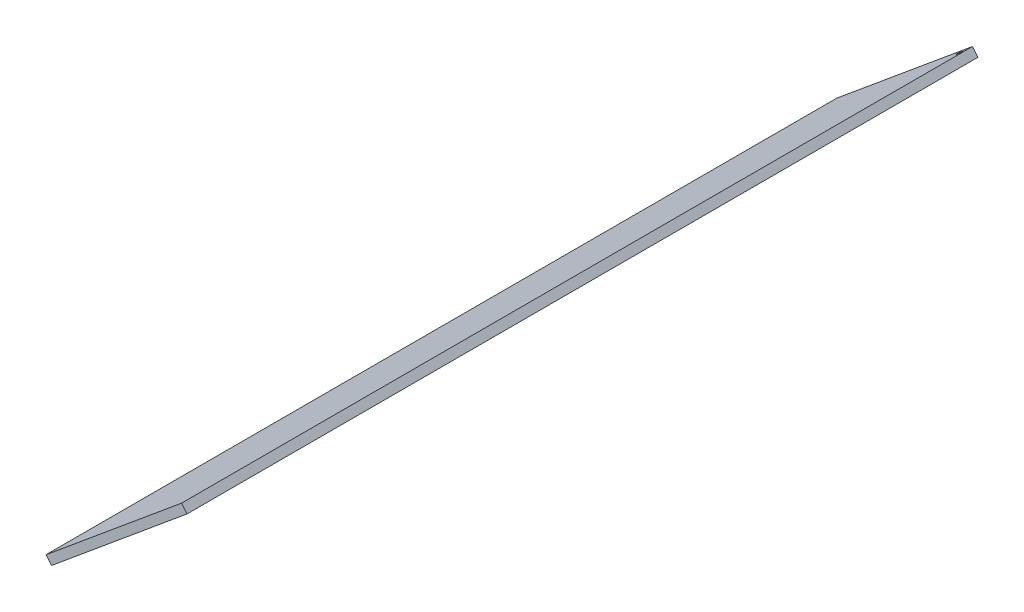
ISO-10303-21;
HEADER;
FILE_DESCRIPTION(('STEP AP214'),'2;1');
FILE_NAME('part.step','',(''),(''),'','','');
FILE_SCHEMA(('AUTOMOTIVE_DESIGN { 1 0 10303 214 1 1 1 1 }'));
ENDSEC;
DATA;
#1=APPLICATION_CONTEXT('core data for automotive mechanical design processes');
#2=APPLICATION_PROTOCOL_DEFINITION('international standard','automotive_design',2000,#1);
#3=PRODUCT_CONTEXT('',#1,'mechanical');
#4=PRODUCT('Part','Part','',(#3));
#5=PRODUCT_RELATED_PRODUCT_CATEGORY('part','',(#4));
#6=PRODUCT_DEFINITION_FORMATION('','',#4);
#7=PRODUCT_DEFINITION_CONTEXT('part definition',#1,'design');
#8=PRODUCT_DEFINITION('design','',#6,#7);
#9=PRODUCT_DEFINITION_SHAPE('','',#8);
#10=(LENGTH_UNIT() NAMED_UNIT(*) SI_UNIT(.MILLI.,.METRE.));
#11=(NAMED_UNIT(*) PLANE_ANGLE_UNIT() SI_UNIT($,.RADIAN.));
#12=(NAMED_UNIT(*) SI_UNIT($,.STERADIAN.) SOLID_ANGLE_UNIT());
#13=UNCERTAINTY_MEASURE_WITH_UNIT(LENGTH_MEASURE(1.E-05),#10,'distance_accuracy_value','');
#14=(GEOMETRIC_REPRESENTATION_CONTEXT(3) GLOBAL_UNCERTAINTY_ASSIGNED_CONTEXT((#13)) GLOBAL_UNIT_ASSIGNED_CONTEXT((#10,
#11,#12)) REPRESENTATION_CONTEXT('',''));
#15=CARTESIAN_POINT('',(0.,0.,0.));
#16=DIRECTION('',(0.,0.,1.));
#17=DIRECTION('',(1.,0.,0.));
#18=AXIS2_PLACEMENT_3D('',#15,#16,#17);
#19=CARTESIAN_POINT('',(104.691015863422,240.200949636311,584.2));
#20=DIRECTION('',(0.769693167120018,0.638413994590309,0.));
#21=DIRECTION('',(-0.638413994590309,0.769693167120018,0.));
#22=AXIS2_PLACEMENT_3D('',#19,#20,#21);
#23=PLANE('',#22);
#24=DIRECTION('',(0.638413994590309,-0.769693167120018,0.));
#25=VECTOR('',#24,1.);
#26=CARTESIAN_POINT('',(104.691015863422,240.200949636311,0.));
#27=LINE('',#26,#25);
#28=CARTESIAN_POINT('',(104.691015863422,240.200949636311,0.));
#29=VERTEX_POINT('',#28);
#30=CARTESIAN_POINT('',(108.744944729071,235.313398025099,0.));
#31=VERTEX_POINT('',#30);
#32=EDGE_CURVE('E104',#29,#31,#27,.T.);
#33=ORIENTED_EDGE('',*,*,#32,.T.);
#34=DIRECTION('',(0.,0.,-1.));
#35=VECTOR('',#34,1.);
#36=CARTESIAN_POINT('',(108.744944729071,235.313398025099,584.2));
#37=LINE('',#36,#35);
#38=CARTESIAN_POINT('',(108.744944729071,235.313398025099,584.2));
#39=VERTEX_POINT('',#38);
#40=EDGE_CURVE('E11',#39,#31,#37,.T.);
#41=ORIENTED_EDGE('',*,*,#40,.F.);
#42=DIRECTION('',(0.638413994590309,-0.769693167120018,0.));
#43=VECTOR('',#42,1.);
#44=CARTESIAN_POINT('',(104.691015863422,240.200949636311,584.2));
#45=LINE('',#44,#43);
#46=CARTESIAN_POINT('',(104.691015863422,240.200949636311,584.2));
#47=VERTEX_POINT('',#46);
#48=EDGE_CURVE('E91',#47,#39,#45,.T.);
#49=ORIENTED_EDGE('',*,*,#48,.F.);
#50=DIRECTION('',(0.,0.,-1.));
#51=VECTOR('',#50,1.);
#52=CARTESIAN_POINT('',(104.691015863422,240.200949636311,584.2));
#53=LINE('',#52,#51);
#54=EDGE_CURVE('E100',#47,#29,#53,.T.);
#55=ORIENTED_EDGE('',*,*,#54,.T.);
#56=EDGE_LOOP('',(#33,#41,#49,#55));
#57=FACE_BOUND('',#56,.T.);
#58=ADVANCED_FACE('F39',(#57),#23,.F.);
#59=CARTESIAN_POINT('',(108.744944729071,235.313398025099,584.2));
#60=DIRECTION('',(-0.63841399459031,0.769693167120018,0.));
#61=DIRECTION('',(-0.769693167120018,-0.63841399459031,0.));
#62=AXIS2_PLACEMENT_3D('',#59,#60,#61);
#63=PLANE('',#62);
#64=CARTESIAN_POINT('',(203.931031665824,314.264508138354,5.08));
#65=DIRECTION('',(0.63841399459031,-0.769693167120018,0.));
#66=DIRECTION('',(0.769693167120018,0.63841399459031,0.));
#67=AXIS2_PLACEMENT_3D('',#64,#65,#66);
#68=CIRCLE('',#67,2.01929999999997);
#69=CARTESIAN_POINT('',(205.485273078189,315.55365751763,5.08));
#70=VERTEX_POINT('',#69);
#71=EDGE_CURVE('E117',#70,#70,#68,.T.);
#72=ORIENTED_EDGE('',*,*,#71,.F.);
#73=EDGE_LOOP('',(#72));
#74=FACE_BOUND('',#73,.T.);
#75=DIRECTION('',(0.769693167120018,0.63841399459031,0.));
#76=VECTOR('',#75,1.);
#77=CARTESIAN_POINT('',(108.744944729071,235.313398025099,0.));
#78=LINE('',#77,#76);
#79=CARTESIAN_POINT('',(208.818583277036,318.318437004003,0.));
#80=VERTEX_POINT('',#79);
#81=EDGE_CURVE('E95',#31,#80,#78,.T.);
#82=ORIENTED_EDGE('',*,*,#81,.T.);
#83=DIRECTION('',(0.,0.,-1.));
#84=VECTOR('',#83,1.);
#85=CARTESIAN_POINT('',(208.818583277036,318.318437004003,584.2));
#86=LINE('',#85,#84);
#87=CARTESIAN_POINT('',(208.818583277036,318.318437004003,584.2));
#88=VERTEX_POINT('',#87);
#89=EDGE_CURVE('E48',#88,#80,#86,.T.);
#90=ORIENTED_EDGE('',*,*,#89,.F.);
#91=DIRECTION('',(0.769693167120018,0.63841399459031,0.));
#92=VECTOR('',#91,1.);
#93=CARTESIAN_POINT('',(108.744944729071,235.313398025099,584.2));
#94=LINE('',#93,#92);
#95=EDGE_CURVE('E86',#39,#88,#94,.T.);
#96=ORIENTED_EDGE('',*,*,#95,.F.);
#97=ORIENTED_EDGE('',*,*,#40,.T.);
#98=EDGE_LOOP('',(#82,#90,#96,#97));
#99=FACE_BOUND('',#98,.T.);
#100=ADVANCED_FACE('F94',(#74,#99),#63,.F.);
#101=CARTESIAN_POINT('',(208.818583277036,318.318437004003,584.2));
#102=DIRECTION('',(-0.769693167120018,-0.63841399459031,0.));
#103=DIRECTION('',(0.63841399459031,-0.769693167120018,0.));
#104=AXIS2_PLACEMENT_3D('',#101,#102,#103);
#105=PLANE('',#104);
#106=DIRECTION('',(-0.63841399459031,0.769693167120018,0.));
#107=VECTOR('',#106,1.);
#108=CARTESIAN_POINT('',(208.818583277036,318.318437004003,0.));
#109=LINE('',#108,#107);
#110=CARTESIAN_POINT('',(204.764654411387,323.205988615215,0.));
#111=VERTEX_POINT('',#110);
#112=EDGE_CURVE('E73',#80,#111,#109,.T.);
#113=ORIENTED_EDGE('',*,*,#112,.T.);
#114=DIRECTION('',(0.,0.,-1.));
#115=VECTOR('',#114,1.);
#116=CARTESIAN_POINT('',(204.764654411387,323.205988615215,584.2));
#117=LINE('',#116,#115);
#118=CARTESIAN_POINT('',(204.764654411387,323.205988615215,584.2));
#119=VERTEX_POINT('',#118);
#120=EDGE_CURVE('E96',#119,#111,#117,.T.);
#121=ORIENTED_EDGE('',*,*,#120,.F.);
#122=DIRECTION('',(-0.63841399459031,0.769693167120018,0.));
#123=VECTOR('',#122,1.);
#124=CARTESIAN_POINT('',(208.818583277036,318.318437004003,584.2));
#125=LINE('',#124,#123);
#126=EDGE_CURVE('E89',#88,#119,#125,.T.);
#127=ORIENTED_EDGE('',*,*,#126,.F.);
#128=ORIENTED_EDGE('',*,*,#89,.T.);
#129=EDGE_LOOP('',(#113,#121,#127,#128));
#130=FACE_BOUND('',#129,.T.);
#131=ADVANCED_FACE('F98',(#130),#105,.F.);
#132=CARTESIAN_POINT('',(204.764654411387,323.205988615215,584.2));
#133=DIRECTION('',(0.63841399459031,-0.769693167120018,0.));
#134=DIRECTION('',(0.769693167120018,0.63841399459031,0.));
#135=AXIS2_PLACEMENT_3D('',#132,#133,#134);
#136=PLANE('',#135);
#137=CARTESIAN_POINT('',(199.877102800175,319.152059749566,5.08));
#138=DIRECTION('',(0.63841399459031,-0.769693167120018,0.));
#139=DIRECTION('',(0.769693167120018,0.63841399459031,0.));
#140=AXIS2_PLACEMENT_3D('',#137,#138,#139);
#141=CIRCLE('',#140,2.01929999999997);
#142=CARTESIAN_POINT('',(201.431344212541,320.441209128843,5.08));
#143=VERTEX_POINT('',#142);
#144=EDGE_CURVE('E42',#143,#143,#141,.T.);
#145=ORIENTED_EDGE('',*,*,#144,.T.);
#146=EDGE_LOOP('',(#145));
#147=FACE_BOUND('',#146,.T.);
#148=DIRECTION('',(-0.769693167120018,-0.63841399459031,0.));
#149=VECTOR('',#148,1.);
#150=CARTESIAN_POINT('',(204.764654411387,323.205988615215,0.));
#151=LINE('',#150,#149);
#152=EDGE_CURVE('E79',#111,#29,#151,.T.);
#153=ORIENTED_EDGE('',*,*,#152,.T.);
#154=ORIENTED_EDGE('',*,*,#54,.F.);
#155=DIRECTION('',(-0.769693167120018,-0.63841399459031,0.));
#156=VECTOR('',#155,1.);
#157=CARTESIAN_POINT('',(204.764654411387,323.205988615215,584.2));
#158=LINE('',#157,#156);
#159=EDGE_CURVE('E56',#119,#47,#158,.T.);
#160=ORIENTED_EDGE('',*,*,#159,.F.);
#161=ORIENTED_EDGE('',*,*,#120,.T.);
#162=EDGE_LOOP('',(#153,#154,#160,#161));
#163=FACE_BOUND('',#162,.T.);
#164=ADVANCED_FACE('F111',(#147,#163),#136,.F.);
#165=CARTESIAN_POINT('',(0.,0.,584.2));
#166=DIRECTION('',(0.,0.,1.));
#167=DIRECTION('',(1.,0.,0.));
#168=AXIS2_PLACEMENT_3D('',#165,#166,#167);
#169=PLANE('',#168);
#170=ORIENTED_EDGE('',*,*,#48,.T.);
#171=ORIENTED_EDGE('',*,*,#95,.T.);
#172=ORIENTED_EDGE('',*,*,#126,.T.);
#173=ORIENTED_EDGE('',*,*,#159,.T.);
#174=EDGE_LOOP('',(#170,#171,#172,#173));
#175=FACE_BOUND('',#174,.T.);
#176=ADVANCED_FACE('F87',(#175),#169,.T.);
#177=CARTESIAN_POINT('',(0.,0.,0.));
#178=DIRECTION('',(0.,0.,1.));
#179=DIRECTION('',(1.,0.,0.));
#180=AXIS2_PLACEMENT_3D('',#177,#178,#179);
#181=PLANE('',#180);
#182=ORIENTED_EDGE('',*,*,#32,.F.);
#183=ORIENTED_EDGE('',*,*,#152,.F.);
#184=ORIENTED_EDGE('',*,*,#112,.F.);
#185=ORIENTED_EDGE('',*,*,#81,.F.);
#186=EDGE_LOOP('',(#182,#183,#184,#185));
#187=FACE_BOUND('',#186,.T.);
#188=ADVANCED_FACE('F114',(#187),#181,.F.);
#189=CARTESIAN_POINT('',(-169.030423973835,763.919256369869,5.08));
#190=DIRECTION('',(0.63841399459031,-0.769693167120018,0.));
#191=DIRECTION('',(0.769693167120018,0.63841399459031,0.));
#192=AXIS2_PLACEMENT_3D('',#189,#190,#191);
#193=CYLINDRICAL_SURFACE('',#192,2.01929999999997);
#194=ORIENTED_EDGE('',*,*,#71,.T.);
#195=EDGE_LOOP('',(#194));
#196=FACE_BOUND('',#195,.T.);
#197=ORIENTED_EDGE('',*,*,#144,.F.);
#198=EDGE_LOOP('',(#197));
#199=FACE_BOUND('',#198,.T.);
#200=ADVANCED_FACE('F125',(#196,#199),#193,.F.);
#201=CLOSED_SHELL('',(#58,#100,#131,#164,#176,#188,#200));
#202=MANIFOLD_SOLID_BREP('B2',#201);
#203=ADVANCED_BREP_SHAPE_REPRESENTATION('',(#18,#202),#14);
#204=SHAPE_DEFINITION_REPRESENTATION(#9,#203);
ENDSEC;
END-ISO-10303-21;
